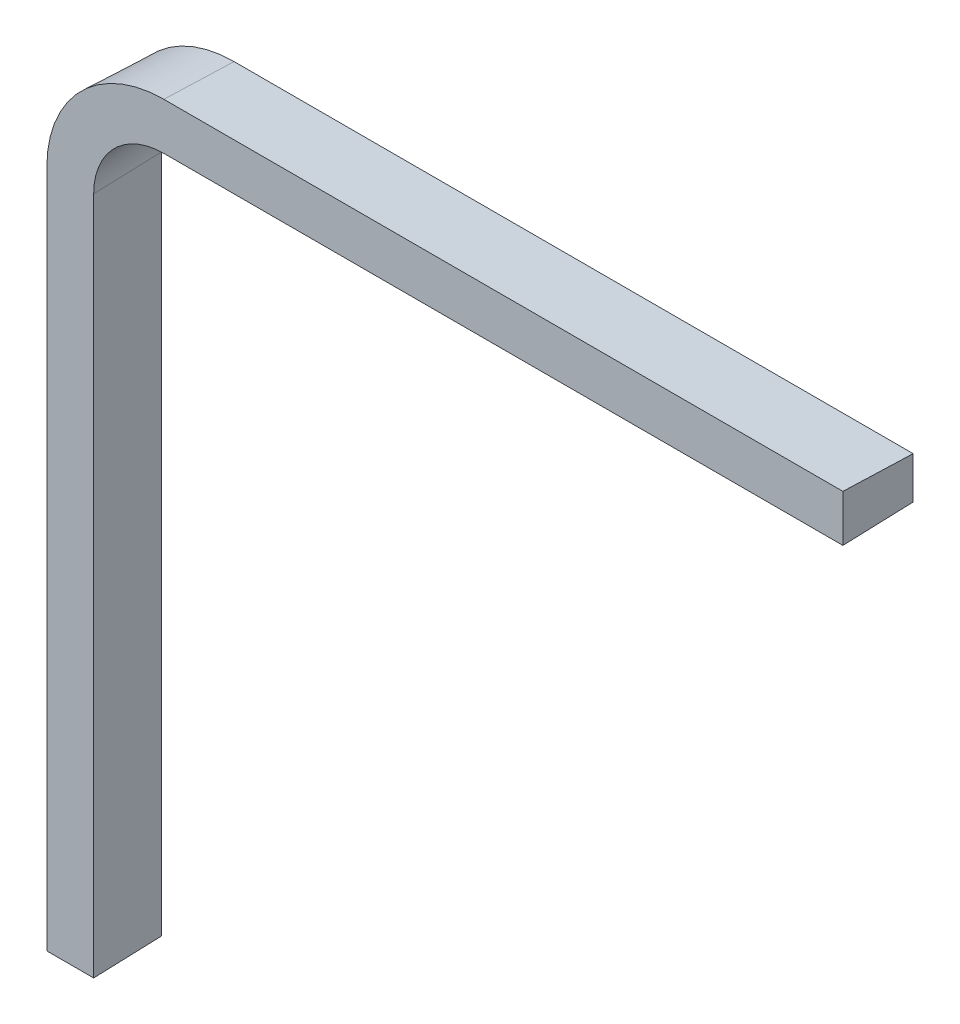
ISO-10303-21;
HEADER;
FILE_DESCRIPTION(('STEP AP214'),'2;1');
FILE_NAME('part.step','',(''),(''),'','','');
FILE_SCHEMA(('AUTOMOTIVE_DESIGN { 1 0 10303 214 1 1 1 1 }'));
ENDSEC;
DATA;
#1=APPLICATION_CONTEXT('core data for automotive mechanical design processes');
#2=APPLICATION_PROTOCOL_DEFINITION('international standard','automotive_design',2000,#1);
#3=PRODUCT_CONTEXT('',#1,'mechanical');
#4=PRODUCT('Part','Part','',(#3));
#5=PRODUCT_RELATED_PRODUCT_CATEGORY('part','',(#4));
#6=PRODUCT_DEFINITION_FORMATION('','',#4);
#7=PRODUCT_DEFINITION_CONTEXT('part definition',#1,'design');
#8=PRODUCT_DEFINITION('design','',#6,#7);
#9=PRODUCT_DEFINITION_SHAPE('','',#8);
#10=(LENGTH_UNIT() NAMED_UNIT(*) SI_UNIT(.MILLI.,.METRE.));
#11=(NAMED_UNIT(*) PLANE_ANGLE_UNIT() SI_UNIT($,.RADIAN.));
#12=(NAMED_UNIT(*) SI_UNIT($,.STERADIAN.) SOLID_ANGLE_UNIT());
#13=UNCERTAINTY_MEASURE_WITH_UNIT(LENGTH_MEASURE(1.E-05),#10,'distance_accuracy_value','');
#14=(GEOMETRIC_REPRESENTATION_CONTEXT(3) GLOBAL_UNCERTAINTY_ASSIGNED_CONTEXT((#13)) GLOBAL_UNIT_ASSIGNED_CONTEXT((#10,
#11,#12)) REPRESENTATION_CONTEXT('',''));
#15=CARTESIAN_POINT('',(0.,0.,0.));
#16=DIRECTION('',(0.,0.,1.));
#17=DIRECTION('',(1.,0.,0.));
#18=AXIS2_PLACEMENT_3D('',#15,#16,#17);
#19=CARTESIAN_POINT('',(-199.644,148.834326841637,19.6585154200166));
#20=DIRECTION('',(0.,0.999390827019096,-0.034899496702501));
#21=DIRECTION('',(0.,0.0348994967025011,0.999390827019096));
#22=AXIS2_PLACEMENT_3D('',#19,#20,#21);
#23=PLANE('',#22);
#24=DIRECTION('',(-1.,0.,0.));
#25=VECTOR('',#24,1.);
#26=CARTESIAN_POINT('',(-199.644,148.834326841637,19.6585154200166));
#27=LINE('',#26,#25);
#28=CARTESIAN_POINT('',(-107.559329378929,148.834326841637,19.6585154200166));
#29=VERTEX_POINT('',#28);
#30=CARTESIAN_POINT('',(-199.644,148.834326841637,19.6585154200166));
#31=VERTEX_POINT('',#30);
#32=EDGE_CURVE('E103',#29,#31,#27,.T.);
#33=ORIENTED_EDGE('',*,*,#32,.F.);
#34=DIRECTION('',(0.,0.0348994967025011,0.999390827019096));
#35=VECTOR('',#34,1.);
#36=CARTESIAN_POINT('',(-107.559329378929,145.051802658223,-88.6588051449923));
#37=LINE('',#36,#35);
#38=CARTESIAN_POINT('',(-107.559329378929,148.501706512228,10.1335154200166));
#39=VERTEX_POINT('',#38);
#40=EDGE_CURVE('E11',#39,#29,#37,.T.);
#41=ORIENTED_EDGE('',*,*,#40,.F.);
#42=DIRECTION('',(-1.,0.,0.));
#43=VECTOR('',#42,1.);
#44=CARTESIAN_POINT('',(-199.644,148.501706512228,10.1335154200166));
#45=LINE('',#44,#43);
#46=CARTESIAN_POINT('',(-199.644,148.501706512228,10.1335154200166));
#47=VERTEX_POINT('',#46);
#48=EDGE_CURVE('E118',#39,#47,#45,.T.);
#49=ORIENTED_EDGE('',*,*,#48,.T.);
#50=DIRECTION('',(0.,0.034899496702501,0.999390827019096));
#51=VECTOR('',#50,1.);
#52=CARTESIAN_POINT('',(-199.644,148.834326841637,19.6585154200166));
#53=LINE('',#52,#51);
#54=EDGE_CURVE('E93',#47,#31,#53,.T.);
#55=ORIENTED_EDGE('',*,*,#54,.T.);
#56=EDGE_LOOP('',(#33,#41,#49,#55));
#57=FACE_BOUND('',#56,.T.);
#58=ADVANCED_FACE('F36',(#57),#23,.T.);
#59=CARTESIAN_POINT('',(-215.509329378929,132.968997462708,19.6585154200166));
#60=DIRECTION('',(-0.999390827019096,0.,-0.034899496702501));
#61=DIRECTION('',(-0.034899496702501,0.,0.999390827019096));
#62=AXIS2_PLACEMENT_3D('',#59,#60,#61);
#63=PLANE('',#62);
#64=DIRECTION('',(-0.034899496702501,0.,0.999390827019096));
#65=VECTOR('',#64,1.);
#66=CARTESIAN_POINT('',(-211.645596717961,40.8843268416371,-90.9843116769334));
#67=LINE('',#66,#65);
#68=CARTESIAN_POINT('',(-215.17670904952,40.8843268416371,10.1335154200166));
#69=VERTEX_POINT('',#68);
#70=CARTESIAN_POINT('',(-215.509329378929,40.8843268416371,19.6585154200166));
#71=VERTEX_POINT('',#70);
#72=EDGE_CURVE('E73',#69,#71,#67,.T.);
#73=ORIENTED_EDGE('',*,*,#72,.T.);
#74=DIRECTION('',(0.,-1.,0.));
#75=VECTOR('',#74,1.);
#76=CARTESIAN_POINT('',(-215.509329378929,132.968997462708,19.6585154200166));
#77=LINE('',#76,#75);
#78=CARTESIAN_POINT('',(-215.509329378929,132.968997462708,19.6585154200166));
#79=VERTEX_POINT('',#78);
#80=EDGE_CURVE('E89',#79,#71,#77,.T.);
#81=ORIENTED_EDGE('',*,*,#80,.F.);
#82=DIRECTION('',(-0.034899496702501,0.,0.999390827019096));
#83=VECTOR('',#82,1.);
#84=CARTESIAN_POINT('',(-215.509329378929,132.968997462708,19.6585154200166));
#85=LINE('',#84,#83);
#86=CARTESIAN_POINT('',(-215.17670904952,132.968997462708,10.1335154200166));
#87=VERTEX_POINT('',#86);
#88=EDGE_CURVE('E130',#87,#79,#85,.T.);
#89=ORIENTED_EDGE('',*,*,#88,.F.);
#90=DIRECTION('',(0.,-1.,0.));
#91=VECTOR('',#90,1.);
#92=CARTESIAN_POINT('',(-215.17670904952,132.968997462708,10.1335154200166));
#93=LINE('',#92,#91);
#94=EDGE_CURVE('E92',#87,#69,#93,.T.);
#95=ORIENTED_EDGE('',*,*,#94,.T.);
#96=EDGE_LOOP('',(#73,#81,#89,#95));
#97=FACE_BOUND('',#96,.T.);
#98=ADVANCED_FACE('F38',(#97),#63,.T.);
#99=CARTESIAN_POINT('',(-199.644,132.968997462708,10.1335154200166));
#100=DIRECTION('',(0.,0.,1.));
#101=DIRECTION('',(1.,0.,0.));
#102=AXIS2_PLACEMENT_3D('',#99,#100,#101);
#103=PLANE('',#102);
#104=DIRECTION('',(0.,1.,0.));
#105=VECTOR('',#104,1.);
#106=CARTESIAN_POINT('',(-209.491949708338,132.968997462708,10.1335154200166));
#107=LINE('',#106,#105);
#108=CARTESIAN_POINT('',(-209.491949708338,132.968997462708,10.1335154200166));
#109=VERTEX_POINT('',#108);
#110=CARTESIAN_POINT('',(-209.491949708338,40.8843268416371,10.1335154200166));
#111=VERTEX_POINT('',#110);
#112=EDGE_CURVE('E106',#109,#111,#107,.F.);
#113=ORIENTED_EDGE('',*,*,#112,.T.);
#114=DIRECTION('',(1.,0.,0.));
#115=VECTOR('',#114,1.);
#116=CARTESIAN_POINT('',(0.,40.8843268416371,10.1335154200166));
#117=LINE('',#116,#115);
#118=EDGE_CURVE('E121',#69,#111,#117,.T.);
#119=ORIENTED_EDGE('',*,*,#118,.F.);
#120=ORIENTED_EDGE('',*,*,#94,.F.);
#121=CARTESIAN_POINT('',(-199.644,132.968997462708,10.1335154200166));
#122=DIRECTION('',(0.,0.,1.));
#123=DIRECTION('',(1.,0.,0.));
#124=AXIS2_PLACEMENT_3D('',#121,#122,#123);
#125=CIRCLE('',#124,15.5327090495201);
#126=EDGE_CURVE('E135',#47,#87,#125,.T.);
#127=ORIENTED_EDGE('',*,*,#126,.F.);
#128=ORIENTED_EDGE('',*,*,#48,.F.);
#129=DIRECTION('',(0.,-1.,0.));
#130=VECTOR('',#129,1.);
#131=CARTESIAN_POINT('',(-107.559329378929,0.,10.1335154200166));
#132=LINE('',#131,#130);
#133=CARTESIAN_POINT('',(-107.559329378929,142.816947171046,10.1335154200166));
#134=VERTEX_POINT('',#133);
#135=EDGE_CURVE('E54',#39,#134,#132,.T.);
#136=ORIENTED_EDGE('',*,*,#135,.T.);
#137=DIRECTION('',(1.,0.,0.));
#138=VECTOR('',#137,1.);
#139=CARTESIAN_POINT('',(-199.644,142.816947171046,10.1335154200166));
#140=LINE('',#139,#138);
#141=CARTESIAN_POINT('',(-199.644,142.816947171046,10.1335154200166));
#142=VERTEX_POINT('',#141);
#143=EDGE_CURVE('E112',#134,#142,#140,.F.);
#144=ORIENTED_EDGE('',*,*,#143,.T.);
#145=CARTESIAN_POINT('',(-199.644,132.968997462708,10.1335154200166));
#146=DIRECTION('',(0.,0.,1.));
#147=DIRECTION('',(1.,0.,0.));
#148=AXIS2_PLACEMENT_3D('',#145,#146,#147);
#149=CIRCLE('',#148,9.8479497083379);
#150=EDGE_CURVE('E115',#142,#109,#149,.T.);
#151=ORIENTED_EDGE('',*,*,#150,.T.);
#152=EDGE_LOOP('',(#113,#119,#120,#127,#128,#136,#144,#151));
#153=FACE_BOUND('',#152,.T.);
#154=ADVANCED_FACE('F155',(#153),#103,.F.);
#155=CARTESIAN_POINT('',(-199.644,132.968997462708,19.6585154200166));
#156=DIRECTION('',(0.,0.,1.));
#157=DIRECTION('',(1.,0.,0.));
#158=AXIS2_PLACEMENT_3D('',#155,#156,#157);
#159=PLANE('',#158);
#160=DIRECTION('',(-1.,0.,0.));
#161=VECTOR('',#160,1.);
#162=CARTESIAN_POINT('',(0.,40.8843268416371,19.6585154200166));
#163=LINE('',#162,#161);
#164=CARTESIAN_POINT('',(-209.159329378929,40.8843268416371,19.6585154200166));
#165=VERTEX_POINT('',#164);
#166=EDGE_CURVE('E46',#165,#71,#163,.T.);
#167=ORIENTED_EDGE('',*,*,#166,.F.);
#168=DIRECTION('',(0.,-1.,0.));
#169=VECTOR('',#168,1.);
#170=CARTESIAN_POINT('',(-209.159329378929,132.968997462708,19.6585154200166));
#171=LINE('',#170,#169);
#172=CARTESIAN_POINT('',(-209.159329378929,132.968997462708,19.6585154200166));
#173=VERTEX_POINT('',#172);
#174=EDGE_CURVE('E40',#173,#165,#171,.T.);
#175=ORIENTED_EDGE('',*,*,#174,.F.);
#176=CARTESIAN_POINT('',(-199.644,132.968997462708,19.6585154200166));
#177=DIRECTION('',(0.,0.,1.));
#178=DIRECTION('',(1.,0.,0.));
#179=AXIS2_PLACEMENT_3D('',#176,#177,#178);
#180=CIRCLE('',#179,9.515329378929);
#181=CARTESIAN_POINT('',(-199.644,142.484326841637,19.6585154200166));
#182=VERTEX_POINT('',#181);
#183=EDGE_CURVE('E128',#182,#173,#180,.T.);
#184=ORIENTED_EDGE('',*,*,#183,.F.);
#185=DIRECTION('',(-1.,0.,0.));
#186=VECTOR('',#185,1.);
#187=CARTESIAN_POINT('',(-199.644,142.484326841637,19.6585154200166));
#188=LINE('',#187,#186);
#189=CARTESIAN_POINT('',(-107.559329378929,142.484326841637,19.6585154200166));
#190=VERTEX_POINT('',#189);
#191=EDGE_CURVE('E101',#190,#182,#188,.T.);
#192=ORIENTED_EDGE('',*,*,#191,.F.);
#193=DIRECTION('',(0.,1.,0.));
#194=VECTOR('',#193,1.);
#195=CARTESIAN_POINT('',(-107.559329378929,0.,19.6585154200166));
#196=LINE('',#195,#194);
#197=EDGE_CURVE('E117',#190,#29,#196,.T.);
#198=ORIENTED_EDGE('',*,*,#197,.T.);
#199=ORIENTED_EDGE('',*,*,#32,.T.);
#200=CARTESIAN_POINT('',(-199.644,132.968997462708,19.6585154200166));
#201=DIRECTION('',(0.,0.,1.));
#202=DIRECTION('',(1.,0.,0.));
#203=AXIS2_PLACEMENT_3D('',#200,#201,#202);
#204=CIRCLE('',#203,15.865329378929);
#205=EDGE_CURVE('E98',#31,#79,#204,.T.);
#206=ORIENTED_EDGE('',*,*,#205,.T.);
#207=ORIENTED_EDGE('',*,*,#80,.T.);
#208=EDGE_LOOP('',(#167,#175,#184,#192,#198,#199,#206,#207));
#209=FACE_BOUND('',#208,.T.);
#210=ADVANCED_FACE('F95',(#209),#159,.T.);
#211=CARTESIAN_POINT('',(-199.644,142.484326841637,19.6585154200166));
#212=DIRECTION('',(0.,-0.999390827019096,-0.034899496702501));
#213=DIRECTION('',(0.,0.0348994967025011,-0.999390827019096));
#214=AXIS2_PLACEMENT_3D('',#211,#212,#213);
#215=PLANE('',#214);
#216=DIRECTION('',(0.,0.0348994967025011,-0.999390827019096));
#217=VECTOR('',#216,1.);
#218=CARTESIAN_POINT('',(-107.559329378929,145.912032225678,-78.4981241365767));
#219=LINE('',#218,#217);
#220=EDGE_CURVE('E99',#134,#190,#219,.F.);
#221=ORIENTED_EDGE('',*,*,#220,.T.);
#222=ORIENTED_EDGE('',*,*,#191,.T.);
#223=DIRECTION('',(0.,-0.034899496702501,0.999390827019096));
#224=VECTOR('',#223,1.);
#225=CARTESIAN_POINT('',(-199.644,142.484326841637,19.6585154200166));
#226=LINE('',#225,#224);
#227=EDGE_CURVE('E123',#142,#182,#226,.T.);
#228=ORIENTED_EDGE('',*,*,#227,.F.);
#229=ORIENTED_EDGE('',*,*,#143,.F.);
#230=EDGE_LOOP('',(#221,#222,#228,#229));
#231=FACE_BOUND('',#230,.T.);
#232=ADVANCED_FACE('F170',(#231),#215,.T.);
#233=CARTESIAN_POINT('',(-209.159329378929,132.968997462708,19.6585154200166));
#234=DIRECTION('',(0.999390827019096,0.,-0.034899496702501));
#235=DIRECTION('',(-0.034899496702501,0.,-0.999390827019096));
#236=AXIS2_PLACEMENT_3D('',#233,#234,#235);
#237=PLANE('',#236);
#238=ORIENTED_EDGE('',*,*,#174,.T.);
#239=DIRECTION('',(-0.034899496702501,0.,-0.999390827019096));
#240=VECTOR('',#239,1.);
#241=CARTESIAN_POINT('',(-212.505826285416,40.8843268416371,-76.1726176046356));
#242=LINE('',#241,#240);
#243=EDGE_CURVE('E78',#111,#165,#242,.F.);
#244=ORIENTED_EDGE('',*,*,#243,.F.);
#245=ORIENTED_EDGE('',*,*,#112,.F.);
#246=DIRECTION('',(0.034899496702501,0.,0.999390827019096));
#247=VECTOR('',#246,1.);
#248=CARTESIAN_POINT('',(-209.159329378929,132.968997462708,19.6585154200166));
#249=LINE('',#248,#247);
#250=EDGE_CURVE('E132',#109,#173,#249,.T.);
#251=ORIENTED_EDGE('',*,*,#250,.T.);
#252=EDGE_LOOP('',(#238,#244,#245,#251));
#253=FACE_BOUND('',#252,.T.);
#254=ADVANCED_FACE('F177',(#253),#237,.T.);
#255=CARTESIAN_POINT('',(-199.644,132.968997462708,19.6585154200166));
#256=DIRECTION('',(0.,0.,1.));
#257=DIRECTION('',(1.,0.,0.));
#258=AXIS2_PLACEMENT_3D('',#255,#256,#257);
#259=CONICAL_SURFACE('',#258,15.865329378929,0.0349065850398867);
#260=ORIENTED_EDGE('',*,*,#205,.F.);
#261=ORIENTED_EDGE('',*,*,#54,.F.);
#262=ORIENTED_EDGE('',*,*,#126,.T.);
#263=ORIENTED_EDGE('',*,*,#88,.T.);
#264=EDGE_LOOP('',(#260,#261,#262,#263));
#265=FACE_BOUND('',#264,.T.);
#266=ADVANCED_FACE('F149',(#265),#259,.T.);
#267=CARTESIAN_POINT('',(-199.644,132.968997462708,19.6585154200166));
#268=DIRECTION('',(0.,0.,-1.));
#269=DIRECTION('',(1.,0.,0.));
#270=AXIS2_PLACEMENT_3D('',#267,#268,#269);
#271=CONICAL_SURFACE('',#270,9.515329378929,0.0349065850398867);
#272=ORIENTED_EDGE('',*,*,#183,.T.);
#273=ORIENTED_EDGE('',*,*,#250,.F.);
#274=ORIENTED_EDGE('',*,*,#150,.F.);
#275=ORIENTED_EDGE('',*,*,#227,.T.);
#276=EDGE_LOOP('',(#272,#273,#274,#275));
#277=FACE_BOUND('',#276,.T.);
#278=ADVANCED_FACE('F175',(#277),#271,.F.);
#279=CARTESIAN_POINT('',(0.,40.8843268416371,-83.593484580002));
#280=DIRECTION('',(0.,1.,0.));
#281=DIRECTION('',(-1.,0.,0.));
#282=AXIS2_PLACEMENT_3D('',#279,#280,#281);
#283=PLANE('',#282);
#284=ORIENTED_EDGE('',*,*,#118,.T.);
#285=ORIENTED_EDGE('',*,*,#243,.T.);
#286=ORIENTED_EDGE('',*,*,#166,.T.);
#287=ORIENTED_EDGE('',*,*,#72,.F.);
#288=EDGE_LOOP('',(#284,#285,#286,#287));
#289=FACE_BOUND('',#288,.T.);
#290=ADVANCED_FACE('F76',(#289),#283,.F.);
#291=CARTESIAN_POINT('',(-107.559329378929,0.,-83.593484580002));
#292=DIRECTION('',(1.,0.,0.));
#293=DIRECTION('',(0.,0.,-1.));
#294=AXIS2_PLACEMENT_3D('',#291,#292,#293);
#295=PLANE('',#294);
#296=ORIENTED_EDGE('',*,*,#40,.T.);
#297=ORIENTED_EDGE('',*,*,#197,.F.);
#298=ORIENTED_EDGE('',*,*,#220,.F.);
#299=ORIENTED_EDGE('',*,*,#135,.F.);
#300=EDGE_LOOP('',(#296,#297,#298,#299));
#301=FACE_BOUND('',#300,.T.);
#302=ADVANCED_FACE('F181',(#301),#295,.T.);
#303=CLOSED_SHELL('',(#58,#98,#154,#210,#232,#254,#266,#278,#290,#302));
#304=MANIFOLD_SOLID_BREP('B2',#303);
#305=ADVANCED_BREP_SHAPE_REPRESENTATION('',(#18,#304),#14);
#306=SHAPE_DEFINITION_REPRESENTATION(#9,#305);
ENDSEC;
END-ISO-10303-21;
